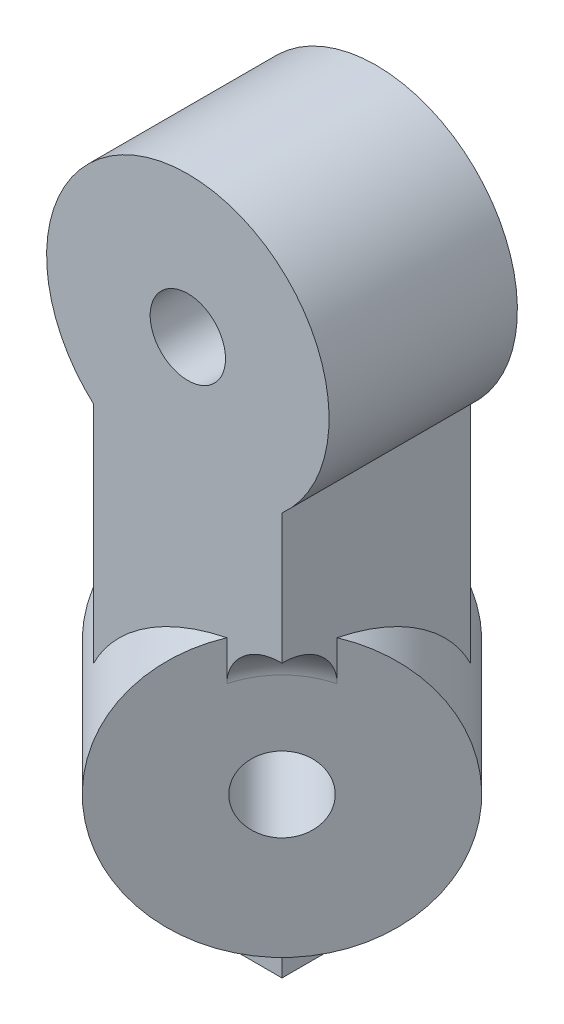
ISO-10303-21;
HEADER;
FILE_DESCRIPTION(('STEP AP214'),'2;1');
FILE_NAME('part.step','',(''),(''),'','','');
FILE_SCHEMA(('AUTOMOTIVE_DESIGN { 1 0 10303 214 1 1 1 1 }'));
ENDSEC;
DATA;
#1=APPLICATION_CONTEXT('core data for automotive mechanical design processes');
#2=APPLICATION_PROTOCOL_DEFINITION('international standard','automotive_design',2000,#1);
#3=PRODUCT_CONTEXT('',#1,'mechanical');
#4=PRODUCT('Part','Part','',(#3));
#5=PRODUCT_RELATED_PRODUCT_CATEGORY('part','',(#4));
#6=PRODUCT_DEFINITION_FORMATION('','',#4);
#7=PRODUCT_DEFINITION_CONTEXT('part definition',#1,'design');
#8=PRODUCT_DEFINITION('design','',#6,#7);
#9=PRODUCT_DEFINITION_SHAPE('','',#8);
#10=(LENGTH_UNIT() NAMED_UNIT(*) SI_UNIT(.MILLI.,.METRE.));
#11=(NAMED_UNIT(*) PLANE_ANGLE_UNIT() SI_UNIT($,.RADIAN.));
#12=(NAMED_UNIT(*) SI_UNIT($,.STERADIAN.) SOLID_ANGLE_UNIT());
#13=UNCERTAINTY_MEASURE_WITH_UNIT(LENGTH_MEASURE(1.E-05),#10,'distance_accuracy_value','');
#14=(GEOMETRIC_REPRESENTATION_CONTEXT(3) GLOBAL_UNCERTAINTY_ASSIGNED_CONTEXT((#13)) GLOBAL_UNIT_ASSIGNED_CONTEXT((#10,
#11,#12)) REPRESENTATION_CONTEXT('',''));
#15=CARTESIAN_POINT('',(0.,0.,0.));
#16=DIRECTION('',(0.,0.,1.));
#17=DIRECTION('',(1.,0.,0.));
#18=AXIS2_PLACEMENT_3D('',#15,#16,#17);
#19=CARTESIAN_POINT('',(-3.5090788794777,-10.0235498921638,1.46446609406726));
#20=DIRECTION('',(0.707106781186547,0.,0.707106781186548));
#21=DIRECTION('',(0.707106781186548,0.,-0.707106781186547));
#22=AXIS2_PLACEMENT_3D('',#19,#20,#21);
#23=CYLINDRICAL_SURFACE('',#22,7.5);
#24=CARTESIAN_POINT('',(-3.5090788794777,-10.0235498921638,1.46446609406726));
#25=DIRECTION('',(-0.707106781186547,0.,-0.707106781186548));
#26=DIRECTION('',(-0.707106781186548,0.,0.707106781186547));
#27=AXIS2_PLACEMENT_3D('',#24,#25,#26);
#28=CIRCLE('',#27,7.5);
#29=CARTESIAN_POINT('',(-2.04461278541044,-2.81517433877762,0.));
#30=VERTEX_POINT('',#29);
#31=CARTESIAN_POINT('',(-4.97354497354497,-2.81517433877762,2.92893218813452));
#32=VERTEX_POINT('',#31);
#33=EDGE_CURVE('E191',#30,#32,#28,.T.);
#34=ORIENTED_EDGE('',*,*,#33,.F.);
#35=CARTESIAN_POINT('',(-4.97354497354496,-10.0235498921638,0.));
#36=DIRECTION('',(0.,0.,1.));
#37=DIRECTION('',(1.,0.,0.));
#38=AXIS2_PLACEMENT_3D('',#35,#36,#37);
#39=ELLIPSE('',#38,10.6066017177982,7.5);
#40=CARTESIAN_POINT('',(5.02645502645504,-7.52354989216375,0.));
#41=VERTEX_POINT('',#40);
#42=EDGE_CURVE('E201',#30,#41,#39,.F.);
#43=ORIENTED_EDGE('',*,*,#42,.T.);
#44=CARTESIAN_POINT('',(5.02645502645504,-10.0235498921638,10.));
#45=DIRECTION('',(-1.,0.,0.));
#46=DIRECTION('',(0.,0.,1.));
#47=AXIS2_PLACEMENT_3D('',#44,#45,#46);
#48=ELLIPSE('',#47,10.6066017177982,7.5);
#49=CARTESIAN_POINT('',(5.02645502645504,-2.81517433877762,7.07106781186548));
#50=VERTEX_POINT('',#49);
#51=EDGE_CURVE('E198',#41,#50,#48,.F.);
#52=ORIENTED_EDGE('',*,*,#51,.T.);
#53=CARTESIAN_POINT('',(3.56198893238777,-10.0235498921638,8.53553390593274));
#54=DIRECTION('',(-0.707106781186547,0.,-0.707106781186548));
#55=DIRECTION('',(-0.707106781186548,0.,0.707106781186547));
#56=AXIS2_PLACEMENT_3D('',#53,#54,#55);
#57=CIRCLE('',#56,7.5);
#58=CARTESIAN_POINT('',(2.09752283832051,-2.81517433877762,10.));
#59=VERTEX_POINT('',#58);
#60=EDGE_CURVE('E190',#50,#59,#57,.T.);
#61=ORIENTED_EDGE('',*,*,#60,.T.);
#62=CARTESIAN_POINT('',(5.02645502645503,-10.0235498921638,10.));
#63=DIRECTION('',(0.,0.,1.));
#64=DIRECTION('',(1.,0.,0.));
#65=AXIS2_PLACEMENT_3D('',#62,#63,#64);
#66=ELLIPSE('',#65,10.6066017177982,7.5);
#67=CARTESIAN_POINT('',(-4.97354497354496,-7.52354989216375,10.));
#68=VERTEX_POINT('',#67);
#69=EDGE_CURVE('E193',#68,#59,#66,.F.);
#70=ORIENTED_EDGE('',*,*,#69,.F.);
#71=CARTESIAN_POINT('',(-4.97354497354496,-10.0235498921638,0.));
#72=DIRECTION('',(1.,0.,0.));
#73=DIRECTION('',(0.,0.,1.));
#74=AXIS2_PLACEMENT_3D('',#71,#72,#73);
#75=ELLIPSE('',#74,10.6066017177982,7.5);
#76=EDGE_CURVE('E230',#68,#32,#75,.F.);
#77=ORIENTED_EDGE('',*,*,#76,.T.);
#78=EDGE_LOOP('',(#34,#43,#52,#61,#70,#77));
#79=FACE_BOUND('',#78,.T.);
#80=CARTESIAN_POINT('',(-1.97354497354496,-10.0235498921638,3.));
#81=DIRECTION('',(1.,0.,0.));
#82=DIRECTION('',(0.,0.,1.));
#83=AXIS2_PLACEMENT_3D('',#80,#81,#82);
#84=ELLIPSE('',#83,10.6066017177982,7.5);
#85=CARTESIAN_POINT('',(-1.97354497354496,-16.9697718868887,7.));
#86=VERTEX_POINT('',#85);
#87=CARTESIAN_POINT('',(-1.97354497354496,-17.5235498921638,3.));
#88=VERTEX_POINT('',#87);
#89=EDGE_CURVE('E243',#86,#88,#84,.T.);
#90=ORIENTED_EDGE('',*,*,#89,.F.);
#91=CARTESIAN_POINT('',(2.02645502645503,-10.0235498921638,7.));
#92=DIRECTION('',(0.,0.,-1.));
#93=DIRECTION('',(1.,0.,0.));
#94=AXIS2_PLACEMENT_3D('',#91,#92,#93);
#95=ELLIPSE('',#94,10.6066017177982,7.5);
#96=CARTESIAN_POINT('',(2.02645502645504,-17.5235498921638,7.));
#97=VERTEX_POINT('',#96);
#98=EDGE_CURVE('E145',#97,#86,#95,.T.);
#99=ORIENTED_EDGE('',*,*,#98,.F.);
#100=CARTESIAN_POINT('',(2.02645502645504,-10.0235498921638,7.));
#101=DIRECTION('',(-1.,0.,0.));
#102=DIRECTION('',(0.,0.,1.));
#103=AXIS2_PLACEMENT_3D('',#100,#101,#102);
#104=ELLIPSE('',#103,10.6066017177982,7.5);
#105=CARTESIAN_POINT('',(2.02645502645504,-16.9697718868887,3.));
#106=VERTEX_POINT('',#105);
#107=EDGE_CURVE('E239',#106,#97,#104,.T.);
#108=ORIENTED_EDGE('',*,*,#107,.F.);
#109=CARTESIAN_POINT('',(-1.97354497354496,-10.0235498921638,3.));
#110=DIRECTION('',(0.,0.,1.));
#111=DIRECTION('',(1.,0.,0.));
#112=AXIS2_PLACEMENT_3D('',#109,#110,#111);
#113=ELLIPSE('',#112,10.6066017177982,7.5);
#114=EDGE_CURVE('E236',#88,#106,#113,.T.);
#115=ORIENTED_EDGE('',*,*,#114,.F.);
#116=EDGE_LOOP('',(#90,#99,#108,#115));
#117=FACE_BOUND('',#116,.T.);
#118=ADVANCED_FACE('F32',(#79,#117),#23,.T.);
#119=CARTESIAN_POINT('',(8.86528979128688,-10.0235498921638,13.8388347648318));
#120=DIRECTION('',(-0.707106781186548,0.,-0.707106781186548));
#121=DIRECTION('',(-0.707106781186548,0.,0.707106781186548));
#122=AXIS2_PLACEMENT_3D('',#119,#120,#121);
#123=CYLINDRICAL_SURFACE('',#122,2.);
#124=CARTESIAN_POINT('',(3.56198893238777,-10.0235498921638,8.53553390593274));
#125=DIRECTION('',(-0.707106781186547,0.,-0.707106781186548));
#126=DIRECTION('',(-0.707106781186548,0.,0.707106781186547));
#127=AXIS2_PLACEMENT_3D('',#124,#125,#126);
#128=CIRCLE('',#127,2.);
#129=CARTESIAN_POINT('',(2.14777537001468,-10.0235498921638,9.94974746830583));
#130=VERTEX_POINT('',#129);
#131=EDGE_CURVE('E233',#130,#130,#128,.T.);
#132=ORIENTED_EDGE('',*,*,#131,.F.);
#133=EDGE_LOOP('',(#132));
#134=FACE_BOUND('',#133,.T.);
#135=CARTESIAN_POINT('',(-3.5090788794777,-10.0235498921638,1.46446609406726));
#136=DIRECTION('',(-0.707106781186547,0.,-0.707106781186548));
#137=DIRECTION('',(-0.707106781186548,0.,0.707106781186547));
#138=AXIS2_PLACEMENT_3D('',#135,#136,#137);
#139=CIRCLE('',#138,2.);
#140=CARTESIAN_POINT('',(-4.9232924418508,-10.0235498921638,2.87867965644036));
#141=VERTEX_POINT('',#140);
#142=EDGE_CURVE('E187',#141,#141,#139,.T.);
#143=ORIENTED_EDGE('',*,*,#142,.T.);
#144=EDGE_LOOP('',(#143));
#145=FACE_BOUND('',#144,.T.);
#146=ADVANCED_FACE('F282',(#134,#145),#123,.F.);
#147=CARTESIAN_POINT('',(0.0264550264550368,9.97645010783625,10.));
#148=DIRECTION('',(0.,0.,1.));
#149=DIRECTION('',(1.,0.,0.));
#150=AXIS2_PLACEMENT_3D('',#147,#148,#149);
#151=PLANE('',#150);
#152=CARTESIAN_POINT('',(0.0264550264550368,9.97645010783625,10.));
#153=DIRECTION('',(0.,0.,1.));
#154=DIRECTION('',(1.,0.,0.));
#155=AXIS2_PLACEMENT_3D('',#152,#153,#154);
#156=CIRCLE('',#155,2.);
#157=CARTESIAN_POINT('',(2.02645502645504,9.97645010783625,10.));
#158=VERTEX_POINT('',#157);
#159=EDGE_CURVE('E205',#158,#158,#156,.T.);
#160=ORIENTED_EDGE('',*,*,#159,.F.);
#161=EDGE_LOOP('',(#160));
#162=FACE_BOUND('',#161,.T.);
#163=ORIENTED_EDGE('',*,*,#69,.T.);
#164=DIRECTION('',(0.,1.,0.));
#165=VECTOR('',#164,1.);
#166=CARTESIAN_POINT('',(2.09752283832051,-10.0235498921638,10.));
#167=LINE('',#166,#165);
#168=CARTESIAN_POINT('',(2.09752283832051,-4.92838766524155,10.));
#169=VERTEX_POINT('',#168);
#170=EDGE_CURVE('E249',#169,#59,#167,.T.);
#171=ORIENTED_EDGE('',*,*,#170,.F.);
#172=CARTESIAN_POINT('',(2.09752283832051,-4.92838766524155,10.));
#173=CARTESIAN_POINT('',(2.0975987974206,-4.81453872385675,10.));
#174=CARTESIAN_POINT('',(2.10928849393918,-4.70125693800122,10.));
#175=CARTESIAN_POINT('',(2.15246533543788,-4.47933570700737,10.));
#176=CARTESIAN_POINT('',(2.18380263184282,-4.37066771191215,10.));
#177=CARTESIAN_POINT('',(2.26271636122661,-4.16029557080934,10.));
#178=CARTESIAN_POINT('',(2.31019798818405,-4.05855483963461,10.));
#179=CARTESIAN_POINT('',(2.41906216475644,-3.86257143228676,10.));
#180=CARTESIAN_POINT('',(2.48047596376291,-3.76834626546055,10.));
#181=CARTESIAN_POINT('',(2.62717292814344,-3.5725422565276,10.));
#182=CARTESIAN_POINT('',(2.71476274216916,-3.472692192706,10.));
#183=CARTESIAN_POINT('',(2.90328326591816,-3.28665436336158,10.));
#184=CARTESIAN_POINT('',(3.00421279826882,-3.20046539357605,10.));
#185=CARTESIAN_POINT('',(3.23399925370536,-3.02999062477479,10.));
#186=CARTESIAN_POINT('',(3.36473813684976,-2.94823328148054,10.));
#187=CARTESIAN_POINT('',(3.63718539667447,-2.80550216134552,10.));
#188=CARTESIAN_POINT('',(3.77890548035957,-2.74455095052779,10.));
#189=CARTESIAN_POINT('',(4.0853035058262,-2.63903782053065,10.));
#190=CARTESIAN_POINT('',(4.25082473654777,-2.59688918631185,10.));
#191=CARTESIAN_POINT('',(4.50231649455919,-2.55413720213158,10.));
#192=CARTESIAN_POINT('',(4.58667878238915,-2.54329839169982,10.));
#193=CARTESIAN_POINT('',(4.75598953381999,-2.52846052891716,10.));
#194=CARTESIAN_POINT('',(4.84093790201998,-2.52446038858071,10.));
#195=CARTESIAN_POINT('',(4.9259499630667,-2.52388660864784,10.));
#196=B_SPLINE_CURVE_WITH_KNOTS('',3,(#172,#173,#174,#175,#176,#177,#178,#179,#180,#181,#182,
#183,#184,#185,#186,#187,#188,#189,#190,#191,#192,#193,#194,#195),.UNSPECIFIED.,.F.,.F.,(4,2,2,
2,2,2,2,2,2,2,2,4),(0.,0.34015826319713,0.677753244772429,1.01339902429625,1.3498052228284,
1.74675876815311,2.14367730145502,2.6043381280253,3.065497004756,3.57539974528328,
3.830331642127,4.08522297727767),.UNSPECIFIED.);
#197=CARTESIAN_POINT('',(4.92594996306671,-2.52388660864784,10.));
#198=VERTEX_POINT('',#197);
#199=EDGE_CURVE('E262',#169,#198,#196,.T.);
#200=ORIENTED_EDGE('',*,*,#199,.T.);
#201=CARTESIAN_POINT('',(5.02645502645503,-10.0235498921638,10.));
#202=DIRECTION('',(0.,0.,1.));
#203=DIRECTION('',(-1.,0.,0.));
#204=AXIS2_PLACEMENT_3D('',#201,#202,#203);
#205=ELLIPSE('',#204,10.6066017177982,7.5);
#206=CARTESIAN_POINT('',(5.02645502645504,-2.52354989216375,10.));
#207=VERTEX_POINT('',#206);
#208=EDGE_CURVE('E185',#198,#207,#205,.F.);
#209=ORIENTED_EDGE('',*,*,#208,.T.);
#210=DIRECTION('',(0.,1.,0.));
#211=VECTOR('',#210,1.);
#212=CARTESIAN_POINT('',(5.02645502645504,-10.0235498921638,10.));
#213=LINE('',#212,#211);
#214=CARTESIAN_POINT('',(5.02645502645504,4.38628016408677,10.));
#215=VERTEX_POINT('',#214);
#216=EDGE_CURVE('E211',#207,#215,#213,.T.);
#217=ORIENTED_EDGE('',*,*,#216,.T.);
#218=CARTESIAN_POINT('',(0.0264550264550368,9.97645010783625,10.));
#219=DIRECTION('',(0.,0.,1.));
#220=DIRECTION('',(1.,0.,0.));
#221=AXIS2_PLACEMENT_3D('',#218,#219,#220);
#222=CIRCLE('',#221,7.5);
#223=CARTESIAN_POINT('',(-4.97354497354496,4.38628016408677,10.));
#224=VERTEX_POINT('',#223);
#225=EDGE_CURVE('E213',#215,#224,#222,.T.);
#226=ORIENTED_EDGE('',*,*,#225,.T.);
#227=DIRECTION('',(0.,-1.,0.));
#228=VECTOR('',#227,1.);
#229=CARTESIAN_POINT('',(-4.97354497354496,-10.0235498921638,10.));
#230=LINE('',#229,#228);
#231=EDGE_CURVE('E216',#224,#68,#230,.T.);
#232=ORIENTED_EDGE('',*,*,#231,.T.);
#233=EDGE_LOOP('',(#163,#171,#200,#209,#217,#226,#232));
#234=FACE_BOUND('',#233,.T.);
#235=ADVANCED_FACE('F277',(#162,#234),#151,.T.);
#236=CARTESIAN_POINT('',(5.02645502645504,-10.0235498921638,10.));
#237=DIRECTION('',(-1.,0.,0.));
#238=DIRECTION('',(0.,0.,1.));
#239=AXIS2_PLACEMENT_3D('',#236,#237,#238);
#240=PLANE('',#239);
#241=CARTESIAN_POINT('',(5.02645502645504,-10.0235498921638,10.));
#242=DIRECTION('',(-1.,0.,0.));
#243=DIRECTION('',(0.,0.,-1.));
#244=AXIS2_PLACEMENT_3D('',#241,#242,#243);
#245=ELLIPSE('',#244,10.6066017177982,7.5);
#246=CARTESIAN_POINT('',(5.02645502645504,-2.52388660864784,9.89949493661167));
#247=VERTEX_POINT('',#246);
#248=EDGE_CURVE('E182',#247,#207,#245,.F.);
#249=ORIENTED_EDGE('',*,*,#248,.F.);
#250=CARTESIAN_POINT('',(5.02645502645504,-2.52388660864784,9.89949493661167));
#251=CARTESIAN_POINT('',(5.02645502645504,-2.52445743201013,9.81473703692029));
#252=CARTESIAN_POINT('',(5.02645502645504,-2.52843624358588,9.73003835069212));
#253=CARTESIAN_POINT('',(5.02645502645504,-2.54319026261689,9.56123249914751));
#254=CARTESIAN_POINT('',(5.02645502645504,-2.55396569314218,9.47712535333747));
#255=CARTESIAN_POINT('',(5.02645502645504,-2.59647675487318,9.22629358742562));
#256=CARTESIAN_POINT('',(5.02645502645504,-2.6383963179216,9.06117729340942));
#257=CARTESIAN_POINT('',(5.02645502645504,-2.7509685050009,8.73333626367033));
#258=CARTESIAN_POINT('',(5.02645502645504,-2.82274784755278,8.57099930000257));
#259=CARTESIAN_POINT('',(5.02645502645504,-2.99372728386486,8.26137582598811));
#260=CARTESIAN_POINT('',(5.02645502645504,-3.09292317791187,8.11408701526929));
#261=CARTESIAN_POINT('',(5.02645502645504,-3.31193973610082,7.84622955747769));
#262=CARTESIAN_POINT('',(5.02645502645504,-3.43067857052178,7.72477874302221));
#263=CARTESIAN_POINT('',(5.02645502645504,-3.68918808558964,7.50660194798718));
#264=CARTESIAN_POINT('',(5.02645502645504,-3.82893369509405,7.40984686004197));
#265=CARTESIAN_POINT('',(5.02645502645504,-4.07599568478942,7.27516086755896));
#266=CARTESIAN_POINT('',(5.02645502645504,-4.17853898052351,7.22837773015165));
#267=CARTESIAN_POINT('',(5.02645502645504,-4.38950941902715,7.15152028669693));
#268=CARTESIAN_POINT('',(5.02645502645504,-4.49791409687013,7.12138654861935));
#269=CARTESIAN_POINT('',(5.02645502645504,-4.66083387559532,7.09131476123913));
#270=CARTESIAN_POINT('',(5.02645502645504,-4.7140110592288,7.08382406513393));
#271=CARTESIAN_POINT('',(5.02645502645504,-4.82090196144966,7.0736994543908));
#272=CARTESIAN_POINT('',(5.02645502645504,-4.87461636991985,7.07107290309314));
#273=CARTESIAN_POINT('',(5.02645502645504,-4.92838766524156,7.07106781186547));
#274=B_SPLINE_CURVE_WITH_KNOTS('',3,(#250,#251,#252,#253,#254,#255,#256,#257,#258,#259,#260,
#261,#262,#263,#264,#265,#266,#267,#268,#269,#270,#271,#272,#273),.UNSPECIFIED.,.F.,.F.,(4,2,2,
2,2,2,2,2,2,2,2,4),(0.,0.25413813248003,0.508284606394619,1.01692937427994,1.54681372285228,
2.0766169477971,2.58342900925118,3.08964093431868,3.4266536242187,3.76245540379124,
3.92336750924317,4.0845230048787),.UNSPECIFIED.);
#275=CARTESIAN_POINT('',(5.02645502645504,-4.92838766524156,7.07106781186547));
#276=VERTEX_POINT('',#275);
#277=EDGE_CURVE('E269',#247,#276,#274,.T.);
#278=ORIENTED_EDGE('',*,*,#277,.T.);
#279=DIRECTION('',(0.,-1.,0.));
#280=VECTOR('',#279,1.);
#281=CARTESIAN_POINT('',(5.02645502645504,-10.0235498921638,7.07106781186547));
#282=LINE('',#281,#280);
#283=EDGE_CURVE('E61',#50,#276,#282,.T.);
#284=ORIENTED_EDGE('',*,*,#283,.F.);
#285=ORIENTED_EDGE('',*,*,#51,.F.);
#286=DIRECTION('',(0.,1.,0.));
#287=VECTOR('',#286,1.);
#288=CARTESIAN_POINT('',(5.02645502645504,-10.0235498921638,0.));
#289=LINE('',#288,#287);
#290=CARTESIAN_POINT('',(5.02645502645504,4.38628016408677,0.));
#291=VERTEX_POINT('',#290);
#292=EDGE_CURVE('E208',#41,#291,#289,.T.);
#293=ORIENTED_EDGE('',*,*,#292,.T.);
#294=DIRECTION('',(0.,0.,-1.));
#295=VECTOR('',#294,1.);
#296=CARTESIAN_POINT('',(5.02645502645504,4.38628016408677,10.));
#297=LINE('',#296,#295);
#298=EDGE_CURVE('E227',#215,#291,#297,.T.);
#299=ORIENTED_EDGE('',*,*,#298,.F.);
#300=ORIENTED_EDGE('',*,*,#216,.F.);
#301=EDGE_LOOP('',(#249,#278,#284,#285,#293,#299,#300));
#302=FACE_BOUND('',#301,.T.);
#303=ADVANCED_FACE('F281',(#302),#240,.F.);
#304=CARTESIAN_POINT('',(0.0264550264550368,9.97645010783625,0.));
#305=DIRECTION('',(0.,0.,1.));
#306=DIRECTION('',(1.,0.,0.));
#307=AXIS2_PLACEMENT_3D('',#304,#305,#306);
#308=PLANE('',#307);
#309=CARTESIAN_POINT('',(0.0264550264550368,9.97645010783625,0.));
#310=DIRECTION('',(0.,0.,1.));
#311=DIRECTION('',(1.,0.,0.));
#312=AXIS2_PLACEMENT_3D('',#309,#310,#311);
#313=CIRCLE('',#312,2.);
#314=CARTESIAN_POINT('',(2.02645502645504,9.97645010783625,0.));
#315=VERTEX_POINT('',#314);
#316=EDGE_CURVE('E204',#315,#315,#313,.T.);
#317=ORIENTED_EDGE('',*,*,#316,.T.);
#318=EDGE_LOOP('',(#317));
#319=FACE_BOUND('',#318,.T.);
#320=ORIENTED_EDGE('',*,*,#42,.F.);
#321=DIRECTION('',(0.,1.,0.));
#322=VECTOR('',#321,1.);
#323=CARTESIAN_POINT('',(-2.04461278541044,-10.0235498921638,0.));
#324=LINE('',#323,#322);
#325=CARTESIAN_POINT('',(-2.04461278541044,-4.92838766524155,0.));
#326=VERTEX_POINT('',#325);
#327=EDGE_CURVE('E256',#326,#30,#324,.T.);
#328=ORIENTED_EDGE('',*,*,#327,.F.);
#329=CARTESIAN_POINT('',(-2.04461278541044,-4.92838766524155,0.));
#330=CARTESIAN_POINT('',(-2.04468874451053,-4.81453872385675,0.));
#331=CARTESIAN_POINT('',(-2.05637844102911,-4.70125693800122,0.));
#332=CARTESIAN_POINT('',(-2.09955528252781,-4.47933570700737,0.));
#333=CARTESIAN_POINT('',(-2.13089257893275,-4.37066771191215,0.));
#334=CARTESIAN_POINT('',(-2.20980630831654,-4.16029557080934,0.));
#335=CARTESIAN_POINT('',(-2.25728793527398,-4.05855483963461,0.));
#336=CARTESIAN_POINT('',(-2.36615211184637,-3.86257143228676,0.));
#337=CARTESIAN_POINT('',(-2.42756591085284,-3.76834626546055,0.));
#338=CARTESIAN_POINT('',(-2.57426287523337,-3.5725422565276,0.));
#339=CARTESIAN_POINT('',(-2.66185268925909,-3.472692192706,0.));
#340=CARTESIAN_POINT('',(-2.85037321300809,-3.28665436336158,0.));
#341=CARTESIAN_POINT('',(-2.95130274535875,-3.20046539357605,0.));
#342=CARTESIAN_POINT('',(-3.18108920079529,-3.02999062477479,0.));
#343=CARTESIAN_POINT('',(-3.31182808393968,-2.94823328148054,0.));
#344=CARTESIAN_POINT('',(-3.5842753437644,-2.80550216134552,0.));
#345=CARTESIAN_POINT('',(-3.7259954274495,-2.7445509505278,0.));
#346=CARTESIAN_POINT('',(-4.03239345291613,-2.63903782053065,0.));
#347=CARTESIAN_POINT('',(-4.1979146836377,-2.59688918631185,0.));
#348=CARTESIAN_POINT('',(-4.44940644164912,-2.55413720213158,0.));
#349=CARTESIAN_POINT('',(-4.53376872947908,-2.54329839169982,0.));
#350=CARTESIAN_POINT('',(-4.70307948090992,-2.52846052891716,0.));
#351=CARTESIAN_POINT('',(-4.78802784910991,-2.52446038858071,0.));
#352=CARTESIAN_POINT('',(-4.87303991015663,-2.52388660864784,0.));
#353=B_SPLINE_CURVE_WITH_KNOTS('',3,(#329,#330,#331,#332,#333,#334,#335,#336,#337,#338,#339,
#340,#341,#342,#343,#344,#345,#346,#347,#348,#349,#350,#351,#352),.UNSPECIFIED.,.F.,.F.,(4,2,2,
2,2,2,2,2,2,2,2,4),(0.,0.340158263197129,0.677753244772428,1.01339902429625,1.3498052228284,
1.7467587681531,2.14367730145502,2.6043381280253,3.065497004756,3.57539974528328,3.830331642127,
4.08522297727767),.UNSPECIFIED.);
#354=CARTESIAN_POINT('',(-4.87303991015663,-2.52388660864784,0.));
#355=VERTEX_POINT('',#354);
#356=EDGE_CURVE('E11',#326,#355,#353,.T.);
#357=ORIENTED_EDGE('',*,*,#356,.T.);
#358=CARTESIAN_POINT('',(-4.97354497354496,-10.0235498921638,0.));
#359=DIRECTION('',(0.,0.,1.));
#360=DIRECTION('',(1.,0.,0.));
#361=AXIS2_PLACEMENT_3D('',#358,#359,#360);
#362=ELLIPSE('',#361,10.6066017177982,7.5);
#363=CARTESIAN_POINT('',(-4.97354497354496,-2.52354989216375,0.));
#364=VERTEX_POINT('',#363);
#365=EDGE_CURVE('E180',#355,#364,#362,.T.);
#366=ORIENTED_EDGE('',*,*,#365,.T.);
#367=DIRECTION('',(0.,-1.,0.));
#368=VECTOR('',#367,1.);
#369=CARTESIAN_POINT('',(-4.97354497354496,-10.0235498921638,0.));
#370=LINE('',#369,#368);
#371=CARTESIAN_POINT('',(-4.97354497354496,4.38628016408677,0.));
#372=VERTEX_POINT('',#371);
#373=EDGE_CURVE('E214',#372,#364,#370,.T.);
#374=ORIENTED_EDGE('',*,*,#373,.F.);
#375=CARTESIAN_POINT('',(0.0264550264550368,9.97645010783625,0.));
#376=DIRECTION('',(0.,0.,1.));
#377=DIRECTION('',(1.,0.,0.));
#378=AXIS2_PLACEMENT_3D('',#375,#376,#377);
#379=CIRCLE('',#378,7.5);
#380=EDGE_CURVE('E221',#291,#372,#379,.T.);
#381=ORIENTED_EDGE('',*,*,#380,.F.);
#382=ORIENTED_EDGE('',*,*,#292,.F.);
#383=EDGE_LOOP('',(#320,#328,#357,#366,#374,#381,#382));
#384=FACE_BOUND('',#383,.T.);
#385=ADVANCED_FACE('F286',(#319,#384),#308,.F.);
#386=CARTESIAN_POINT('',(-4.97354497354496,-10.0235498921638,10.));
#387=DIRECTION('',(1.,0.,0.));
#388=DIRECTION('',(0.,0.,-1.));
#389=AXIS2_PLACEMENT_3D('',#386,#387,#388);
#390=PLANE('',#389);
#391=ORIENTED_EDGE('',*,*,#373,.T.);
#392=CARTESIAN_POINT('',(-4.97354497354496,-10.0235498921638,0.));
#393=DIRECTION('',(1.,0.,0.));
#394=DIRECTION('',(0.,0.,1.));
#395=AXIS2_PLACEMENT_3D('',#392,#393,#394);
#396=ELLIPSE('',#395,10.6066017177982,7.5);
#397=CARTESIAN_POINT('',(-4.97354497354496,-2.52388660864784,0.100505063388326));
#398=VERTEX_POINT('',#397);
#399=EDGE_CURVE('E149',#364,#398,#396,.T.);
#400=ORIENTED_EDGE('',*,*,#399,.T.);
#401=CARTESIAN_POINT('',(-4.97354497354496,-2.52388660864784,0.100505063388334));
#402=CARTESIAN_POINT('',(-4.97354497354496,-2.52445743201013,0.185262963079709));
#403=CARTESIAN_POINT('',(-4.97354497354496,-2.52843624358588,0.26996164930788));
#404=CARTESIAN_POINT('',(-4.97354497354496,-2.54319026261689,0.438767500852493));
#405=CARTESIAN_POINT('',(-4.97354497354496,-2.55396569314218,0.522874646662526));
#406=CARTESIAN_POINT('',(-4.97354497354496,-2.59647675487318,0.773706412574377));
#407=CARTESIAN_POINT('',(-4.97354497354496,-2.6383963179216,0.938822706590575));
#408=CARTESIAN_POINT('',(-4.97354497354496,-2.7509685050009,1.26666373632967));
#409=CARTESIAN_POINT('',(-4.97354497354496,-2.82274784755278,1.42900069999743));
#410=CARTESIAN_POINT('',(-4.97354497354496,-2.99372728386487,1.73862417401189));
#411=CARTESIAN_POINT('',(-4.97354497354496,-3.09292317791187,1.88591298473071));
#412=CARTESIAN_POINT('',(-4.97354497354496,-3.31193973610082,2.1537704425223));
#413=CARTESIAN_POINT('',(-4.97354497354496,-3.43067857052178,2.27522125697779));
#414=CARTESIAN_POINT('',(-4.97354497354496,-3.68918808558964,2.49339805201282));
#415=CARTESIAN_POINT('',(-4.97354497354496,-3.82893369509405,2.59015313995803));
#416=CARTESIAN_POINT('',(-4.97354497354496,-4.07599568478942,2.72483913244104));
#417=CARTESIAN_POINT('',(-4.97354497354496,-4.17853898052351,2.77162226984834));
#418=CARTESIAN_POINT('',(-4.97354497354496,-4.38950941902715,2.84847971330306));
#419=CARTESIAN_POINT('',(-4.97354497354496,-4.49791409687013,2.87861345138065));
#420=CARTESIAN_POINT('',(-4.97354497354496,-4.66083387559532,2.90868523876086));
#421=CARTESIAN_POINT('',(-4.97354497354496,-4.7140110592288,2.91617593486606));
#422=CARTESIAN_POINT('',(-4.97354497354496,-4.82090196144966,2.92630054560919));
#423=CARTESIAN_POINT('',(-4.97354497354496,-4.87461636991985,2.92892709690686));
#424=CARTESIAN_POINT('',(-4.97354497354496,-4.92838766524155,2.92893218813452));
#425=B_SPLINE_CURVE_WITH_KNOTS('',3,(#401,#402,#403,#404,#405,#406,#407,#408,#409,#410,#411,
#412,#413,#414,#415,#416,#417,#418,#419,#420,#421,#422,#423,#424),.UNSPECIFIED.,.F.,.F.,(4,2,2,
2,2,2,2,2,2,2,2,4),(0.,0.254138132480029,0.508284606394619,1.01692937427994,1.54681372285229,
2.0766169477971,2.58342900925118,3.08964093431868,3.42665362421869,3.76245540379123,
3.92336750924317,4.0845230048787),.UNSPECIFIED.);
#426=CARTESIAN_POINT('',(-4.97354497354496,-4.92838766524155,2.92893218813452));
#427=VERTEX_POINT('',#426);
#428=EDGE_CURVE('E46',#398,#427,#425,.T.);
#429=ORIENTED_EDGE('',*,*,#428,.T.);
#430=DIRECTION('',(0.,-1.,0.));
#431=VECTOR('',#430,1.);
#432=CARTESIAN_POINT('',(-4.97354497354496,-10.0235498921638,2.92893218813452));
#433=LINE('',#432,#431);
#434=EDGE_CURVE('E53',#32,#427,#433,.T.);
#435=ORIENTED_EDGE('',*,*,#434,.F.);
#436=ORIENTED_EDGE('',*,*,#76,.F.);
#437=ORIENTED_EDGE('',*,*,#231,.F.);
#438=DIRECTION('',(0.,0.,-1.));
#439=VECTOR('',#438,1.);
#440=CARTESIAN_POINT('',(-4.97354497354496,4.38628016408677,10.));
#441=LINE('',#440,#439);
#442=EDGE_CURVE('E219',#224,#372,#441,.T.);
#443=ORIENTED_EDGE('',*,*,#442,.T.);
#444=EDGE_LOOP('',(#391,#400,#429,#435,#436,#437,#443));
#445=FACE_BOUND('',#444,.T.);
#446=ADVANCED_FACE('F290',(#445),#390,.F.);
#447=CARTESIAN_POINT('',(0.0264550264550368,9.97645010783625,10.));
#448=DIRECTION('',(0.,0.,-1.));
#449=DIRECTION('',(-1.,0.,0.));
#450=AXIS2_PLACEMENT_3D('',#447,#448,#449);
#451=CYLINDRICAL_SURFACE('',#450,7.5);
#452=ORIENTED_EDGE('',*,*,#380,.T.);
#453=ORIENTED_EDGE('',*,*,#442,.F.);
#454=ORIENTED_EDGE('',*,*,#225,.F.);
#455=ORIENTED_EDGE('',*,*,#298,.T.);
#456=EDGE_LOOP('',(#452,#453,#454,#455));
#457=FACE_BOUND('',#456,.T.);
#458=ADVANCED_FACE('F295',(#457),#451,.T.);
#459=CARTESIAN_POINT('',(0.0264550264550368,9.97645010783625,10.));
#460=DIRECTION('',(0.,0.,-1.));
#461=DIRECTION('',(-1.,0.,0.));
#462=AXIS2_PLACEMENT_3D('',#459,#460,#461);
#463=CYLINDRICAL_SURFACE('',#462,2.);
#464=ORIENTED_EDGE('',*,*,#159,.T.);
#465=EDGE_LOOP('',(#464));
#466=FACE_BOUND('',#465,.T.);
#467=ORIENTED_EDGE('',*,*,#316,.F.);
#468=EDGE_LOOP('',(#467));
#469=FACE_BOUND('',#468,.T.);
#470=ADVANCED_FACE('F284',(#466,#469),#463,.F.);
#471=CARTESIAN_POINT('',(-3.5090788794777,-10.0235498921638,1.46446609406726));
#472=DIRECTION('',(-0.707106781186547,0.,-0.707106781186548));
#473=DIRECTION('',(-0.707106781186548,0.,0.707106781186547));
#474=AXIS2_PLACEMENT_3D('',#471,#472,#473);
#475=PLANE('',#474);
#476=ORIENTED_EDGE('',*,*,#142,.F.);
#477=EDGE_LOOP('',(#476));
#478=FACE_BOUND('',#477,.T.);
#479=ORIENTED_EDGE('',*,*,#33,.T.);
#480=ORIENTED_EDGE('',*,*,#434,.T.);
#481=CARTESIAN_POINT('',(-3.5090788794777,-10.0235498921638,1.46446609406726));
#482=DIRECTION('',(-0.707106781186547,0.,-0.707106781186548));
#483=DIRECTION('',(-0.707106781186548,0.,0.707106781186547));
#484=AXIS2_PLACEMENT_3D('',#481,#482,#483);
#485=CIRCLE('',#484,5.5);
#486=EDGE_CURVE('E258',#427,#326,#485,.T.);
#487=ORIENTED_EDGE('',*,*,#486,.T.);
#488=ORIENTED_EDGE('',*,*,#327,.T.);
#489=EDGE_LOOP('',(#479,#480,#487,#488));
#490=FACE_BOUND('',#489,.T.);
#491=ADVANCED_FACE('F336',(#478,#490),#475,.T.);
#492=CARTESIAN_POINT('',(3.56198893238777,-10.0235498921638,8.53553390593274));
#493=DIRECTION('',(-0.707106781186547,0.,-0.707106781186548));
#494=DIRECTION('',(-0.707106781186548,0.,0.707106781186547));
#495=AXIS2_PLACEMENT_3D('',#492,#493,#494);
#496=PLANE('',#495);
#497=ORIENTED_EDGE('',*,*,#131,.T.);
#498=EDGE_LOOP('',(#497));
#499=FACE_BOUND('',#498,.T.);
#500=CARTESIAN_POINT('',(3.56198893238777,-10.0235498921638,8.53553390593274));
#501=DIRECTION('',(-0.707106781186547,0.,-0.707106781186548));
#502=DIRECTION('',(-0.707106781186548,0.,0.707106781186547));
#503=AXIS2_PLACEMENT_3D('',#500,#501,#502);
#504=CIRCLE('',#503,5.5);
#505=EDGE_CURVE('E246',#276,#169,#504,.F.);
#506=ORIENTED_EDGE('',*,*,#505,.T.);
#507=ORIENTED_EDGE('',*,*,#170,.T.);
#508=ORIENTED_EDGE('',*,*,#60,.F.);
#509=ORIENTED_EDGE('',*,*,#283,.T.);
#510=EDGE_LOOP('',(#506,#507,#508,#509));
#511=FACE_BOUND('',#510,.T.);
#512=ADVANCED_FACE('F307',(#499,#511),#496,.F.);
#513=CARTESIAN_POINT('',(9.92594996306671,-10.0235498921638,14.8994949366117));
#514=DIRECTION('',(-0.707106781186548,0.,-0.707106781186548));
#515=DIRECTION('',(-0.707106781186548,0.,0.707106781186548));
#516=AXIS2_PLACEMENT_3D('',#513,#514,#515);
#517=CYLINDRICAL_SURFACE('',#516,7.5);
#518=ORIENTED_EDGE('',*,*,#208,.F.);
#519=CARTESIAN_POINT('',(4.97620249476087,-10.0235498921638,9.94974746830583));
#520=DIRECTION('',(-0.707106781186547,0.,-0.707106781186548));
#521=DIRECTION('',(-0.707106781186548,0.,0.707106781186547));
#522=AXIS2_PLACEMENT_3D('',#519,#520,#521);
#523=CIRCLE('',#522,7.5);
#524=EDGE_CURVE('E251',#198,#247,#523,.T.);
#525=ORIENTED_EDGE('',*,*,#524,.T.);
#526=ORIENTED_EDGE('',*,*,#248,.T.);
#527=EDGE_LOOP('',(#518,#525,#526));
#528=FACE_BOUND('',#527,.T.);
#529=ADVANCED_FACE('F326',(#528),#517,.F.);
#530=CARTESIAN_POINT('',(-9.87303991015663,-10.0235498921638,-4.89949493661168));
#531=DIRECTION('',(0.707106781186547,0.,0.707106781186548));
#532=DIRECTION('',(0.707106781186548,0.,-0.707106781186547));
#533=AXIS2_PLACEMENT_3D('',#530,#531,#532);
#534=CYLINDRICAL_SURFACE('',#533,7.5);
#535=ORIENTED_EDGE('',*,*,#365,.F.);
#536=CARTESIAN_POINT('',(-4.9232924418508,-10.0235498921638,0.0502525316941659));
#537=DIRECTION('',(-0.707106781186547,0.,-0.707106781186548));
#538=DIRECTION('',(-0.707106781186548,0.,0.707106781186547));
#539=AXIS2_PLACEMENT_3D('',#536,#537,#538);
#540=CIRCLE('',#539,7.5);
#541=EDGE_CURVE('E253',#355,#398,#540,.F.);
#542=ORIENTED_EDGE('',*,*,#541,.T.);
#543=ORIENTED_EDGE('',*,*,#399,.F.);
#544=EDGE_LOOP('',(#535,#542,#543));
#545=FACE_BOUND('',#544,.T.);
#546=ADVANCED_FACE('F328',(#545),#534,.F.);
#547=CARTESIAN_POINT('',(-1.97354497354496,-15.,3.));
#548=DIRECTION('',(1.,0.,0.));
#549=DIRECTION('',(0.,0.,-1.));
#550=AXIS2_PLACEMENT_3D('',#547,#548,#549);
#551=PLANE('',#550);
#552=DIRECTION('',(0.,-1.,0.));
#553=VECTOR('',#552,1.);
#554=CARTESIAN_POINT('',(-1.97354497354496,-15.,7.));
#555=LINE('',#554,#553);
#556=CARTESIAN_POINT('',(-1.97354497354496,-20.,7.));
#557=VERTEX_POINT('',#556);
#558=EDGE_CURVE('E139',#86,#557,#555,.T.);
#559=ORIENTED_EDGE('',*,*,#558,.F.);
#560=ORIENTED_EDGE('',*,*,#89,.T.);
#561=DIRECTION('',(0.,-1.,0.));
#562=VECTOR('',#561,1.);
#563=CARTESIAN_POINT('',(-1.97354497354496,-15.,3.));
#564=LINE('',#563,#562);
#565=CARTESIAN_POINT('',(-1.97354497354496,-20.,3.));
#566=VERTEX_POINT('',#565);
#567=EDGE_CURVE('E162',#88,#566,#564,.T.);
#568=ORIENTED_EDGE('',*,*,#567,.T.);
#569=DIRECTION('',(0.,0.,1.));
#570=VECTOR('',#569,1.);
#571=CARTESIAN_POINT('',(-1.97354497354496,-20.,3.));
#572=LINE('',#571,#570);
#573=EDGE_CURVE('E156',#566,#557,#572,.T.);
#574=ORIENTED_EDGE('',*,*,#573,.T.);
#575=EDGE_LOOP('',(#559,#560,#568,#574));
#576=FACE_BOUND('',#575,.T.);
#577=ADVANCED_FACE('F160',(#576),#551,.F.);
#578=CARTESIAN_POINT('',(2.02645502645504,-15.,7.));
#579=DIRECTION('',(0.,0.,-1.));
#580=DIRECTION('',(-1.,0.,0.));
#581=AXIS2_PLACEMENT_3D('',#578,#579,#580);
#582=PLANE('',#581);
#583=CARTESIAN_POINT('',(0.0264550264550369,-18.,7.));
#584=DIRECTION('',(0.,0.,-1.));
#585=DIRECTION('',(-1.,0.,0.));
#586=AXIS2_PLACEMENT_3D('',#583,#584,#585);
#587=CIRCLE('',#586,0.5);
#588=CARTESIAN_POINT('',(-0.473544973544963,-18.,7.));
#589=VERTEX_POINT('',#588);
#590=EDGE_CURVE('E164',#589,#589,#587,.T.);
#591=ORIENTED_EDGE('',*,*,#590,.T.);
#592=EDGE_LOOP('',(#591));
#593=FACE_BOUND('',#592,.T.);
#594=DIRECTION('',(0.,-1.,0.));
#595=VECTOR('',#594,1.);
#596=CARTESIAN_POINT('',(2.02645502645504,-15.,7.));
#597=LINE('',#596,#595);
#598=CARTESIAN_POINT('',(2.02645502645504,-20.,7.));
#599=VERTEX_POINT('',#598);
#600=EDGE_CURVE('E150',#97,#599,#597,.T.);
#601=ORIENTED_EDGE('',*,*,#600,.F.);
#602=ORIENTED_EDGE('',*,*,#98,.T.);
#603=ORIENTED_EDGE('',*,*,#558,.T.);
#604=DIRECTION('',(1.,0.,0.));
#605=VECTOR('',#604,1.);
#606=CARTESIAN_POINT('',(2.02645502645504,-20.,7.));
#607=LINE('',#606,#605);
#608=EDGE_CURVE('E143',#557,#599,#607,.T.);
#609=ORIENTED_EDGE('',*,*,#608,.T.);
#610=EDGE_LOOP('',(#601,#602,#603,#609));
#611=FACE_BOUND('',#610,.T.);
#612=ADVANCED_FACE('F142',(#593,#611),#582,.F.);
#613=CARTESIAN_POINT('',(2.02645502645504,-15.,3.));
#614=DIRECTION('',(-1.,0.,0.));
#615=DIRECTION('',(0.,0.,1.));
#616=AXIS2_PLACEMENT_3D('',#613,#614,#615);
#617=PLANE('',#616);
#618=DIRECTION('',(0.,-1.,0.));
#619=VECTOR('',#618,1.);
#620=CARTESIAN_POINT('',(2.02645502645504,-15.,3.));
#621=LINE('',#620,#619);
#622=CARTESIAN_POINT('',(2.02645502645504,-20.,3.));
#623=VERTEX_POINT('',#622);
#624=EDGE_CURVE('E175',#106,#623,#621,.T.);
#625=ORIENTED_EDGE('',*,*,#624,.F.);
#626=ORIENTED_EDGE('',*,*,#107,.T.);
#627=ORIENTED_EDGE('',*,*,#600,.T.);
#628=DIRECTION('',(0.,0.,-1.));
#629=VECTOR('',#628,1.);
#630=CARTESIAN_POINT('',(2.02645502645504,-20.,3.));
#631=LINE('',#630,#629);
#632=EDGE_CURVE('E158',#599,#623,#631,.T.);
#633=ORIENTED_EDGE('',*,*,#632,.T.);
#634=EDGE_LOOP('',(#625,#626,#627,#633));
#635=FACE_BOUND('',#634,.T.);
#636=ADVANCED_FACE('F377',(#635),#617,.F.);
#637=CARTESIAN_POINT('',(2.02645502645504,-15.,3.));
#638=DIRECTION('',(0.,0.,1.));
#639=DIRECTION('',(1.,0.,0.));
#640=AXIS2_PLACEMENT_3D('',#637,#638,#639);
#641=PLANE('',#640);
#642=CARTESIAN_POINT('',(0.0264550264550374,-18.,3.));
#643=DIRECTION('',(0.,0.,-1.));
#644=DIRECTION('',(-1.,0.,0.));
#645=AXIS2_PLACEMENT_3D('',#642,#643,#644);
#646=CIRCLE('',#645,0.5);
#647=CARTESIAN_POINT('',(-0.473544973544963,-18.,3.));
#648=VERTEX_POINT('',#647);
#649=EDGE_CURVE('E167',#648,#648,#646,.T.);
#650=ORIENTED_EDGE('',*,*,#649,.F.);
#651=EDGE_LOOP('',(#650));
#652=FACE_BOUND('',#651,.T.);
#653=ORIENTED_EDGE('',*,*,#567,.F.);
#654=ORIENTED_EDGE('',*,*,#114,.T.);
#655=ORIENTED_EDGE('',*,*,#624,.T.);
#656=DIRECTION('',(-1.,0.,0.));
#657=VECTOR('',#656,1.);
#658=CARTESIAN_POINT('',(2.02645502645504,-20.,3.));
#659=LINE('',#658,#657);
#660=EDGE_CURVE('E172',#623,#566,#659,.T.);
#661=ORIENTED_EDGE('',*,*,#660,.T.);
#662=EDGE_LOOP('',(#653,#654,#655,#661));
#663=FACE_BOUND('',#662,.T.);
#664=ADVANCED_FACE('F371',(#652,#663),#641,.F.);
#665=CARTESIAN_POINT('',(0.,-20.,0.));
#666=DIRECTION('',(0.,-1.,0.));
#667=DIRECTION('',(0.,0.,-1.));
#668=AXIS2_PLACEMENT_3D('',#665,#666,#667);
#669=PLANE('',#668);
#670=ORIENTED_EDGE('',*,*,#573,.F.);
#671=ORIENTED_EDGE('',*,*,#660,.F.);
#672=ORIENTED_EDGE('',*,*,#632,.F.);
#673=ORIENTED_EDGE('',*,*,#608,.F.);
#674=EDGE_LOOP('',(#670,#671,#672,#673));
#675=FACE_BOUND('',#674,.T.);
#676=ADVANCED_FACE('F154',(#675),#669,.T.);
#677=CARTESIAN_POINT('',(4.97620249476087,-10.0235498921638,9.94974746830583));
#678=DIRECTION('',(-0.707106781186547,0.,-0.707106781186548));
#679=DIRECTION('',(-0.707106781186548,0.,0.707106781186547));
#680=AXIS2_PLACEMENT_3D('',#677,#678,#679);
#681=TOROIDAL_SURFACE('',#680,5.5,2.);
#682=ORIENTED_EDGE('',*,*,#277,.F.);
#683=ORIENTED_EDGE('',*,*,#524,.F.);
#684=ORIENTED_EDGE('',*,*,#199,.F.);
#685=ORIENTED_EDGE('',*,*,#505,.F.);
#686=EDGE_LOOP('',(#682,#683,#684,#685));
#687=FACE_BOUND('',#686,.T.);
#688=ADVANCED_FACE('F275',(#687),#681,.F.);
#689=CARTESIAN_POINT('',(-4.9232924418508,-10.0235498921638,0.050252531694165));
#690=DIRECTION('',(-0.707106781186547,0.,-0.707106781186548));
#691=DIRECTION('',(-0.707106781186548,0.,0.707106781186547));
#692=AXIS2_PLACEMENT_3D('',#689,#690,#691);
#693=TOROIDAL_SURFACE('',#692,5.5,2.);
#694=ORIENTED_EDGE('',*,*,#356,.F.);
#695=ORIENTED_EDGE('',*,*,#486,.F.);
#696=ORIENTED_EDGE('',*,*,#428,.F.);
#697=ORIENTED_EDGE('',*,*,#541,.F.);
#698=EDGE_LOOP('',(#694,#695,#696,#697));
#699=FACE_BOUND('',#698,.T.);
#700=ADVANCED_FACE('F34',(#699),#693,.F.);
#701=CARTESIAN_POINT('',(0.0264550264550363,-18.,13.));
#702=DIRECTION('',(0.,0.,-1.));
#703=DIRECTION('',(-1.,0.,0.));
#704=AXIS2_PLACEMENT_3D('',#701,#702,#703);
#705=CYLINDRICAL_SURFACE('',#704,0.5);
#706=ORIENTED_EDGE('',*,*,#649,.T.);
#707=EDGE_LOOP('',(#706));
#708=FACE_BOUND('',#707,.T.);
#709=ORIENTED_EDGE('',*,*,#590,.F.);
#710=EDGE_LOOP('',(#709));
#711=FACE_BOUND('',#710,.T.);
#712=ADVANCED_FACE('F361',(#708,#711),#705,.F.);
#713=CLOSED_SHELL('',(#118,#146,#235,#303,#385,#446,#458,#470,#491,#512,#529,#546,#577,#612,
#636,#664,#676,#688,#700,#712));
#714=MANIFOLD_SOLID_BREP('B2',#713);
#715=ADVANCED_BREP_SHAPE_REPRESENTATION('',(#18,#714),#14);
#716=SHAPE_DEFINITION_REPRESENTATION(#9,#715);
ENDSEC;
END-ISO-10303-21;
